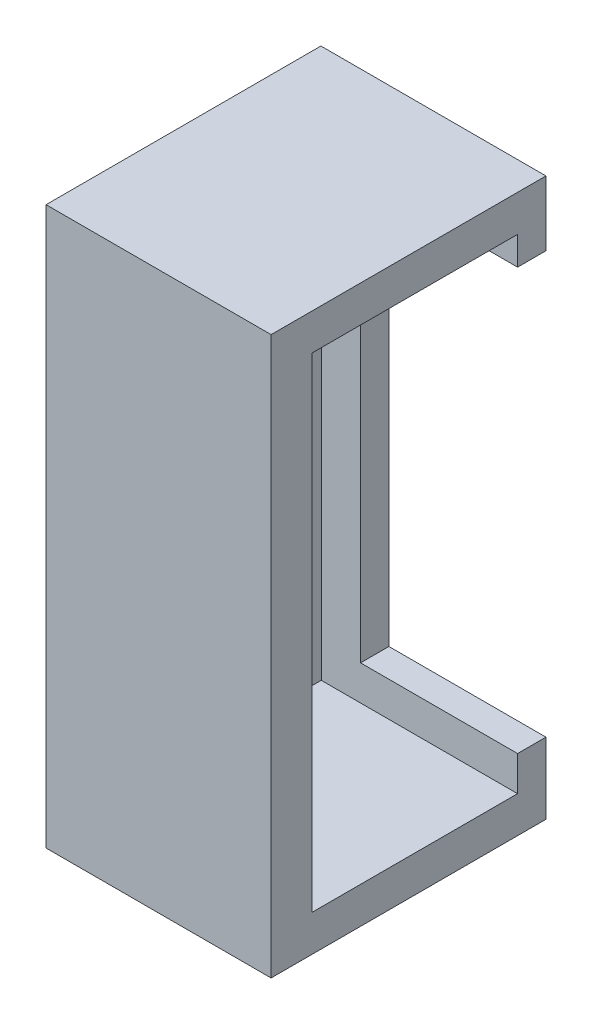
ISO-10303-21;
HEADER;
FILE_DESCRIPTION(('STEP AP214'),'2;1');
FILE_NAME('part.step','',(''),(''),'','','');
FILE_SCHEMA(('AUTOMOTIVE_DESIGN { 1 0 10303 214 1 1 1 1 }'));
ENDSEC;
DATA;
#1=APPLICATION_CONTEXT('core data for automotive mechanical design processes');
#2=APPLICATION_PROTOCOL_DEFINITION('international standard','automotive_design',2000,#1);
#3=PRODUCT_CONTEXT('',#1,'mechanical');
#4=PRODUCT('Part','Part','',(#3));
#5=PRODUCT_RELATED_PRODUCT_CATEGORY('part','',(#4));
#6=PRODUCT_DEFINITION_FORMATION('','',#4);
#7=PRODUCT_DEFINITION_CONTEXT('part definition',#1,'design');
#8=PRODUCT_DEFINITION('design','',#6,#7);
#9=PRODUCT_DEFINITION_SHAPE('','',#8);
#10=(LENGTH_UNIT() NAMED_UNIT(*) SI_UNIT(.MILLI.,.METRE.));
#11=(NAMED_UNIT(*) PLANE_ANGLE_UNIT() SI_UNIT($,.RADIAN.));
#12=(NAMED_UNIT(*) SI_UNIT($,.STERADIAN.) SOLID_ANGLE_UNIT());
#13=UNCERTAINTY_MEASURE_WITH_UNIT(LENGTH_MEASURE(1.E-05),#10,'distance_accuracy_value','');
#14=(GEOMETRIC_REPRESENTATION_CONTEXT(3) GLOBAL_UNCERTAINTY_ASSIGNED_CONTEXT((#13)) GLOBAL_UNIT_ASSIGNED_CONTEXT((#10,
#11,#12)) REPRESENTATION_CONTEXT('',''));
#15=CARTESIAN_POINT('',(0.,0.,0.));
#16=DIRECTION('',(0.,0.,1.));
#17=DIRECTION('',(1.,0.,0.));
#18=AXIS2_PLACEMENT_3D('',#15,#16,#17);
#19=CARTESIAN_POINT('',(28.6589872044418,70.9585500494591,70.));
#20=DIRECTION('',(-1.,0.,0.));
#21=DIRECTION('',(0.,0.,1.));
#22=AXIS2_PLACEMENT_3D('',#19,#20,#21);
#23=PLANE('',#22);
#24=DIRECTION('',(0.,1.,0.));
#25=VECTOR('',#24,1.);
#26=CARTESIAN_POINT('',(28.6589872044418,61.6875546341879,7.22550558069185));
#27=LINE('',#26,#25);
#28=CARTESIAN_POINT('',(28.6589872044418,54.4420343508905,7.22550558069185));
#29=VERTEX_POINT('',#28);
#30=CARTESIAN_POINT('',(28.6589872044418,61.6875546341879,7.22550558069185));
#31=VERTEX_POINT('',#30);
#32=EDGE_CURVE('E57',#29,#31,#27,.T.);
#33=ORIENTED_EDGE('',*,*,#32,.F.);
#34=DIRECTION('',(0.,0.,1.));
#35=VECTOR('',#34,1.);
#36=CARTESIAN_POINT('',(28.6589872044418,54.4420343508905,7.22550558069185));
#37=LINE('',#36,#35);
#38=CARTESIAN_POINT('',(28.6589872044418,54.4420343508905,0.));
#39=VERTEX_POINT('',#38);
#40=EDGE_CURVE('E137',#39,#29,#37,.T.);
#41=ORIENTED_EDGE('',*,*,#40,.F.);
#42=DIRECTION('',(0.,1.,0.));
#43=VECTOR('',#42,1.);
#44=CARTESIAN_POINT('',(28.6589872044418,70.9585500494591,0.));
#45=LINE('',#44,#43);
#46=CARTESIAN_POINT('',(28.6589872044418,70.9585500494591,0.));
#47=VERTEX_POINT('',#46);
#48=EDGE_CURVE('E174',#39,#47,#45,.T.);
#49=ORIENTED_EDGE('',*,*,#48,.T.);
#50=DIRECTION('',(0.,0.,-1.));
#51=VECTOR('',#50,1.);
#52=CARTESIAN_POINT('',(28.6589872044418,70.9585500494591,70.));
#53=LINE('',#52,#51);
#54=CARTESIAN_POINT('',(28.6589872044418,70.9585500494591,70.));
#55=VERTEX_POINT('',#54);
#56=EDGE_CURVE('E11',#55,#47,#53,.T.);
#57=ORIENTED_EDGE('',*,*,#56,.F.);
#58=DIRECTION('',(0.,1.,0.));
#59=VECTOR('',#58,1.);
#60=CARTESIAN_POINT('',(28.6589872044418,70.9585500494591,70.));
#61=LINE('',#60,#59);
#62=CARTESIAN_POINT('',(28.6589872044418,-70.9585500494591,70.));
#63=VERTEX_POINT('',#62);
#64=EDGE_CURVE('E180',#63,#55,#61,.T.);
#65=ORIENTED_EDGE('',*,*,#64,.F.);
#66=DIRECTION('',(0.,0.,-1.));
#67=VECTOR('',#66,1.);
#68=CARTESIAN_POINT('',(28.6589872044418,-70.9585500494591,70.));
#69=LINE('',#68,#67);
#70=CARTESIAN_POINT('',(28.6589872044418,-70.9585500494591,0.));
#71=VERTEX_POINT('',#70);
#72=EDGE_CURVE('E190',#63,#71,#69,.T.);
#73=ORIENTED_EDGE('',*,*,#72,.T.);
#74=CARTESIAN_POINT('',(28.6589872044418,-52.8319187323795,0.));
#75=VERTEX_POINT('',#74);
#76=EDGE_CURVE('E191',#71,#75,#45,.T.);
#77=ORIENTED_EDGE('',*,*,#76,.T.);
#78=DIRECTION('',(0.,0.,-1.));
#79=VECTOR('',#78,1.);
#80=CARTESIAN_POINT('',(28.6589872044418,-52.8319187323795,7.22550558069185));
#81=LINE('',#80,#79);
#82=CARTESIAN_POINT('',(28.6589872044418,-52.8319187323795,7.22550558069185));
#83=VERTEX_POINT('',#82);
#84=EDGE_CURVE('E350',#83,#75,#81,.T.);
#85=ORIENTED_EDGE('',*,*,#84,.F.);
#86=CARTESIAN_POINT('',(28.6589872044418,-61.6875546341879,7.22550558069185));
#87=VERTEX_POINT('',#86);
#88=EDGE_CURVE('E142',#87,#83,#27,.T.);
#89=ORIENTED_EDGE('',*,*,#88,.F.);
#90=DIRECTION('',(0.,0.,-1.));
#91=VECTOR('',#90,1.);
#92=CARTESIAN_POINT('',(28.6589872044418,-61.6875546341879,59.554263182287));
#93=LINE('',#92,#91);
#94=CARTESIAN_POINT('',(28.6589872044418,-61.6875546341879,59.554263182287));
#95=VERTEX_POINT('',#94);
#96=EDGE_CURVE('E153',#95,#87,#93,.T.);
#97=ORIENTED_EDGE('',*,*,#96,.F.);
#98=DIRECTION('',(0.,-1.,0.));
#99=VECTOR('',#98,1.);
#100=CARTESIAN_POINT('',(28.6589872044418,61.6875546341879,59.554263182287));
#101=LINE('',#100,#99);
#102=CARTESIAN_POINT('',(28.6589872044418,61.6875546341879,59.554263182287));
#103=VERTEX_POINT('',#102);
#104=EDGE_CURVE('E167',#103,#95,#101,.T.);
#105=ORIENTED_EDGE('',*,*,#104,.F.);
#106=DIRECTION('',(0.,0.,1.));
#107=VECTOR('',#106,1.);
#108=CARTESIAN_POINT('',(28.6589872044418,61.6875546341879,59.554263182287));
#109=LINE('',#108,#107);
#110=EDGE_CURVE('E164',#31,#103,#109,.T.);
#111=ORIENTED_EDGE('',*,*,#110,.F.);
#112=EDGE_LOOP('',(#33,#41,#49,#57,#65,#73,#77,#85,#89,#97,#105,#111));
#113=FACE_BOUND('',#112,.T.);
#114=ADVANCED_FACE('F35',(#113),#23,.F.);
#115=CARTESIAN_POINT('',(-28.6589872044418,70.9585500494591,70.));
#116=DIRECTION('',(0.,-1.,0.));
#117=DIRECTION('',(0.,0.,-1.));
#118=AXIS2_PLACEMENT_3D('',#115,#116,#117);
#119=PLANE('',#118);
#120=DIRECTION('',(-1.,0.,0.));
#121=VECTOR('',#120,1.);
#122=CARTESIAN_POINT('',(-28.6589872044418,70.9585500494591,0.));
#123=LINE('',#122,#121);
#124=CARTESIAN_POINT('',(-28.6589872044418,70.9585500494591,0.));
#125=VERTEX_POINT('',#124);
#126=EDGE_CURVE('E194',#47,#125,#123,.T.);
#127=ORIENTED_EDGE('',*,*,#126,.T.);
#128=DIRECTION('',(0.,0.,-1.));
#129=VECTOR('',#128,1.);
#130=CARTESIAN_POINT('',(-28.6589872044418,70.9585500494591,70.));
#131=LINE('',#130,#129);
#132=CARTESIAN_POINT('',(-28.6589872044418,70.9585500494591,70.));
#133=VERTEX_POINT('',#132);
#134=EDGE_CURVE('E42',#133,#125,#131,.T.);
#135=ORIENTED_EDGE('',*,*,#134,.F.);
#136=DIRECTION('',(-1.,0.,0.));
#137=VECTOR('',#136,1.);
#138=CARTESIAN_POINT('',(-28.6589872044418,70.9585500494591,70.));
#139=LINE('',#138,#137);
#140=EDGE_CURVE('E183',#55,#133,#139,.T.);
#141=ORIENTED_EDGE('',*,*,#140,.F.);
#142=ORIENTED_EDGE('',*,*,#56,.T.);
#143=EDGE_LOOP('',(#127,#135,#141,#142));
#144=FACE_BOUND('',#143,.T.);
#145=ADVANCED_FACE('F226',(#144),#119,.F.);
#146=CARTESIAN_POINT('',(-28.6589872044418,70.9585500494591,70.));
#147=DIRECTION('',(1.,0.,0.));
#148=DIRECTION('',(0.,0.,-1.));
#149=AXIS2_PLACEMENT_3D('',#146,#147,#148);
#150=PLANE('',#149);
#151=DIRECTION('',(0.,-1.,0.));
#152=VECTOR('',#151,1.);
#153=CARTESIAN_POINT('',(-28.6589872044418,70.9585500494591,0.));
#154=LINE('',#153,#152);
#155=CARTESIAN_POINT('',(-28.6589872044418,-70.9585500494591,0.));
#156=VERTEX_POINT('',#155);
#157=EDGE_CURVE('E196',#125,#156,#154,.T.);
#158=ORIENTED_EDGE('',*,*,#157,.T.);
#159=DIRECTION('',(0.,0.,-1.));
#160=VECTOR('',#159,1.);
#161=CARTESIAN_POINT('',(-28.6589872044418,-70.9585500494591,70.));
#162=LINE('',#161,#160);
#163=CARTESIAN_POINT('',(-28.6589872044418,-70.9585500494591,70.));
#164=VERTEX_POINT('',#163);
#165=EDGE_CURVE('E201',#164,#156,#162,.T.);
#166=ORIENTED_EDGE('',*,*,#165,.F.);
#167=DIRECTION('',(0.,-1.,0.));
#168=VECTOR('',#167,1.);
#169=CARTESIAN_POINT('',(-28.6589872044418,70.9585500494591,70.));
#170=LINE('',#169,#168);
#171=EDGE_CURVE('E186',#133,#164,#170,.T.);
#172=ORIENTED_EDGE('',*,*,#171,.F.);
#173=ORIENTED_EDGE('',*,*,#134,.T.);
#174=EDGE_LOOP('',(#158,#166,#172,#173));
#175=FACE_BOUND('',#174,.T.);
#176=ADVANCED_FACE('F208',(#175),#150,.F.);
#177=CARTESIAN_POINT('',(-28.6589872044418,-70.9585500494591,70.));
#178=DIRECTION('',(0.,1.,0.));
#179=DIRECTION('',(0.,0.,1.));
#180=AXIS2_PLACEMENT_3D('',#177,#178,#179);
#181=PLANE('',#180);
#182=DIRECTION('',(1.,0.,0.));
#183=VECTOR('',#182,1.);
#184=CARTESIAN_POINT('',(-28.6589872044418,-70.9585500494591,0.));
#185=LINE('',#184,#183);
#186=EDGE_CURVE('E184',#156,#71,#185,.T.);
#187=ORIENTED_EDGE('',*,*,#186,.T.);
#188=ORIENTED_EDGE('',*,*,#72,.F.);
#189=DIRECTION('',(1.,0.,0.));
#190=VECTOR('',#189,1.);
#191=CARTESIAN_POINT('',(-28.6589872044418,-70.9585500494591,70.));
#192=LINE('',#191,#190);
#193=EDGE_CURVE('E188',#164,#63,#192,.T.);
#194=ORIENTED_EDGE('',*,*,#193,.F.);
#195=ORIENTED_EDGE('',*,*,#165,.T.);
#196=EDGE_LOOP('',(#187,#188,#194,#195));
#197=FACE_BOUND('',#196,.T.);
#198=ADVANCED_FACE('F219',(#197),#181,.F.);
#199=CARTESIAN_POINT('',(0.,0.,70.));
#200=DIRECTION('',(0.,0.,1.));
#201=DIRECTION('',(1.,0.,0.));
#202=AXIS2_PLACEMENT_3D('',#199,#200,#201);
#203=PLANE('',#202);
#204=ORIENTED_EDGE('',*,*,#64,.T.);
#205=ORIENTED_EDGE('',*,*,#140,.T.);
#206=ORIENTED_EDGE('',*,*,#171,.T.);
#207=ORIENTED_EDGE('',*,*,#193,.T.);
#208=EDGE_LOOP('',(#204,#205,#206,#207));
#209=FACE_BOUND('',#208,.T.);
#210=ADVANCED_FACE('F225',(#209),#203,.T.);
#211=CARTESIAN_POINT('',(0.,0.,0.));
#212=DIRECTION('',(0.,0.,1.));
#213=DIRECTION('',(1.,0.,0.));
#214=AXIS2_PLACEMENT_3D('',#211,#212,#213);
#215=PLANE('',#214);
#216=ORIENTED_EDGE('',*,*,#48,.F.);
#217=DIRECTION('',(1.,0.,0.));
#218=VECTOR('',#217,1.);
#219=CARTESIAN_POINT('',(-11.3410127955582,54.4420343508905,0.));
#220=LINE('',#219,#218);
#221=CARTESIAN_POINT('',(-11.3410127955582,54.4420343508905,0.));
#222=VERTEX_POINT('',#221);
#223=EDGE_CURVE('E144',#222,#39,#220,.T.);
#224=ORIENTED_EDGE('',*,*,#223,.F.);
#225=DIRECTION('',(0.,1.,0.));
#226=VECTOR('',#225,1.);
#227=CARTESIAN_POINT('',(-11.3410127955582,54.4420343508905,0.));
#228=LINE('',#227,#226);
#229=CARTESIAN_POINT('',(-11.3410127955582,-52.8319187323795,0.));
#230=VERTEX_POINT('',#229);
#231=EDGE_CURVE('E132',#230,#222,#228,.T.);
#232=ORIENTED_EDGE('',*,*,#231,.F.);
#233=DIRECTION('',(1.,0.,0.));
#234=VECTOR('',#233,1.);
#235=CARTESIAN_POINT('',(-11.3410127955582,-52.8319187323795,0.));
#236=LINE('',#235,#234);
#237=EDGE_CURVE('E130',#230,#75,#236,.T.);
#238=ORIENTED_EDGE('',*,*,#237,.T.);
#239=ORIENTED_EDGE('',*,*,#76,.F.);
#240=ORIENTED_EDGE('',*,*,#186,.F.);
#241=ORIENTED_EDGE('',*,*,#157,.F.);
#242=ORIENTED_EDGE('',*,*,#126,.F.);
#243=EDGE_LOOP('',(#216,#224,#232,#238,#239,#240,#241,#242));
#244=FACE_BOUND('',#243,.T.);
#245=ADVANCED_FACE('F215',(#244),#215,.F.);
#246=CARTESIAN_POINT('',(-21.3410127955582,61.6875546341879,7.22550558069185));
#247=DIRECTION('',(0.,0.,-1.));
#248=DIRECTION('',(-1.,0.,0.));
#249=AXIS2_PLACEMENT_3D('',#246,#247,#248);
#250=PLANE('',#249);
#251=DIRECTION('',(0.,-1.,0.));
#252=VECTOR('',#251,1.);
#253=CARTESIAN_POINT('',(-11.3410127955582,54.4420343508905,7.22550558069185));
#254=LINE('',#253,#252);
#255=CARTESIAN_POINT('',(-11.3410127955582,54.4420343508905,7.22550558069185));
#256=VERTEX_POINT('',#255);
#257=CARTESIAN_POINT('',(-11.3410127955582,-52.8319187323795,7.22550558069185));
#258=VERTEX_POINT('',#257);
#259=EDGE_CURVE('E133',#256,#258,#254,.T.);
#260=ORIENTED_EDGE('',*,*,#259,.F.);
#261=DIRECTION('',(1.,0.,0.));
#262=VECTOR('',#261,1.);
#263=CARTESIAN_POINT('',(-11.3410127955582,54.4420343508905,7.22550558069185));
#264=LINE('',#263,#262);
#265=EDGE_CURVE('E348',#256,#29,#264,.T.);
#266=ORIENTED_EDGE('',*,*,#265,.T.);
#267=ORIENTED_EDGE('',*,*,#32,.T.);
#268=DIRECTION('',(1.,0.,0.));
#269=VECTOR('',#268,1.);
#270=CARTESIAN_POINT('',(-21.3410127955582,61.6875546341879,7.22550558069185));
#271=LINE('',#270,#269);
#272=CARTESIAN_POINT('',(-21.3410127955582,61.6875546341879,7.22550558069185));
#273=VERTEX_POINT('',#272);
#274=EDGE_CURVE('E162',#273,#31,#271,.T.);
#275=ORIENTED_EDGE('',*,*,#274,.F.);
#276=DIRECTION('',(0.,1.,0.));
#277=VECTOR('',#276,1.);
#278=CARTESIAN_POINT('',(-21.3410127955582,61.6875546341879,7.22550558069185));
#279=LINE('',#278,#277);
#280=CARTESIAN_POINT('',(-21.3410127955582,-61.6875546341879,7.22550558069185));
#281=VERTEX_POINT('',#280);
#282=EDGE_CURVE('E149',#281,#273,#279,.T.);
#283=ORIENTED_EDGE('',*,*,#282,.F.);
#284=DIRECTION('',(1.,0.,0.));
#285=VECTOR('',#284,1.);
#286=CARTESIAN_POINT('',(-21.3410127955582,-61.6875546341879,7.22550558069185));
#287=LINE('',#286,#285);
#288=EDGE_CURVE('E172',#281,#87,#287,.T.);
#289=ORIENTED_EDGE('',*,*,#288,.T.);
#290=ORIENTED_EDGE('',*,*,#88,.T.);
#291=DIRECTION('',(1.,0.,0.));
#292=VECTOR('',#291,1.);
#293=CARTESIAN_POINT('',(-11.3410127955582,-52.8319187323795,7.22550558069185));
#294=LINE('',#293,#292);
#295=EDGE_CURVE('E127',#258,#83,#294,.T.);
#296=ORIENTED_EDGE('',*,*,#295,.F.);
#297=EDGE_LOOP('',(#260,#266,#267,#275,#283,#289,#290,#296));
#298=FACE_BOUND('',#297,.T.);
#299=ADVANCED_FACE('F140',(#298),#250,.F.);
#300=CARTESIAN_POINT('',(-21.3410127955582,-61.6875546341879,59.554263182287));
#301=DIRECTION('',(0.,-1.,0.));
#302=DIRECTION('',(0.,0.,-1.));
#303=AXIS2_PLACEMENT_3D('',#300,#301,#302);
#304=PLANE('',#303);
#305=ORIENTED_EDGE('',*,*,#96,.T.);
#306=ORIENTED_EDGE('',*,*,#288,.F.);
#307=DIRECTION('',(0.,0.,-1.));
#308=VECTOR('',#307,1.);
#309=CARTESIAN_POINT('',(-21.3410127955582,-61.6875546341879,59.554263182287));
#310=LINE('',#309,#308);
#311=CARTESIAN_POINT('',(-21.3410127955582,-61.6875546341879,59.554263182287));
#312=VERTEX_POINT('',#311);
#313=EDGE_CURVE('E159',#312,#281,#310,.T.);
#314=ORIENTED_EDGE('',*,*,#313,.F.);
#315=DIRECTION('',(1.,0.,0.));
#316=VECTOR('',#315,1.);
#317=CARTESIAN_POINT('',(-21.3410127955582,-61.6875546341879,59.554263182287));
#318=LINE('',#317,#316);
#319=EDGE_CURVE('E175',#312,#95,#318,.T.);
#320=ORIENTED_EDGE('',*,*,#319,.T.);
#321=EDGE_LOOP('',(#305,#306,#314,#320));
#322=FACE_BOUND('',#321,.T.);
#323=ADVANCED_FACE('F242',(#322),#304,.F.);
#324=CARTESIAN_POINT('',(-21.3410127955582,61.6875546341879,59.554263182287));
#325=DIRECTION('',(0.,0.,1.));
#326=DIRECTION('',(1.,0.,0.));
#327=AXIS2_PLACEMENT_3D('',#324,#325,#326);
#328=PLANE('',#327);
#329=ORIENTED_EDGE('',*,*,#104,.T.);
#330=ORIENTED_EDGE('',*,*,#319,.F.);
#331=DIRECTION('',(0.,-1.,0.));
#332=VECTOR('',#331,1.);
#333=CARTESIAN_POINT('',(-21.3410127955582,61.6875546341879,59.554263182287));
#334=LINE('',#333,#332);
#335=CARTESIAN_POINT('',(-21.3410127955582,61.6875546341879,59.554263182287));
#336=VERTEX_POINT('',#335);
#337=EDGE_CURVE('E156',#336,#312,#334,.T.);
#338=ORIENTED_EDGE('',*,*,#337,.F.);
#339=DIRECTION('',(1.,0.,0.));
#340=VECTOR('',#339,1.);
#341=CARTESIAN_POINT('',(-21.3410127955582,61.6875546341879,59.554263182287));
#342=LINE('',#341,#340);
#343=EDGE_CURVE('E177',#336,#103,#342,.T.);
#344=ORIENTED_EDGE('',*,*,#343,.T.);
#345=EDGE_LOOP('',(#329,#330,#338,#344));
#346=FACE_BOUND('',#345,.T.);
#347=ADVANCED_FACE('F247',(#346),#328,.F.);
#348=CARTESIAN_POINT('',(-21.3410127955582,61.6875546341879,59.554263182287));
#349=DIRECTION('',(0.,1.,0.));
#350=DIRECTION('',(0.,0.,1.));
#351=AXIS2_PLACEMENT_3D('',#348,#349,#350);
#352=PLANE('',#351);
#353=ORIENTED_EDGE('',*,*,#110,.T.);
#354=ORIENTED_EDGE('',*,*,#343,.F.);
#355=DIRECTION('',(0.,0.,1.));
#356=VECTOR('',#355,1.);
#357=CARTESIAN_POINT('',(-21.3410127955582,61.6875546341879,59.554263182287));
#358=LINE('',#357,#356);
#359=EDGE_CURVE('E152',#273,#336,#358,.T.);
#360=ORIENTED_EDGE('',*,*,#359,.F.);
#361=ORIENTED_EDGE('',*,*,#274,.T.);
#362=EDGE_LOOP('',(#353,#354,#360,#361));
#363=FACE_BOUND('',#362,.T.);
#364=ADVANCED_FACE('F243',(#363),#352,.F.);
#365=CARTESIAN_POINT('',(-21.3410127955582,0.,0.));
#366=DIRECTION('',(1.,0.,0.));
#367=DIRECTION('',(0.,0.,-1.));
#368=AXIS2_PLACEMENT_3D('',#365,#366,#367);
#369=PLANE('',#368);
#370=ORIENTED_EDGE('',*,*,#282,.T.);
#371=ORIENTED_EDGE('',*,*,#359,.T.);
#372=ORIENTED_EDGE('',*,*,#337,.T.);
#373=ORIENTED_EDGE('',*,*,#313,.T.);
#374=EDGE_LOOP('',(#370,#371,#372,#373));
#375=FACE_BOUND('',#374,.T.);
#376=ADVANCED_FACE('F246',(#375),#369,.T.);
#377=CARTESIAN_POINT('',(-11.3410127955582,54.4420343508905,7.22550558069185));
#378=DIRECTION('',(0.,1.,0.));
#379=DIRECTION('',(0.,0.,1.));
#380=AXIS2_PLACEMENT_3D('',#377,#378,#379);
#381=PLANE('',#380);
#382=ORIENTED_EDGE('',*,*,#40,.T.);
#383=ORIENTED_EDGE('',*,*,#265,.F.);
#384=DIRECTION('',(0.,0.,1.));
#385=VECTOR('',#384,1.);
#386=CARTESIAN_POINT('',(-11.3410127955582,54.4420343508905,7.22550558069185));
#387=LINE('',#386,#385);
#388=EDGE_CURVE('E49',#222,#256,#387,.T.);
#389=ORIENTED_EDGE('',*,*,#388,.F.);
#390=ORIENTED_EDGE('',*,*,#223,.T.);
#391=EDGE_LOOP('',(#382,#383,#389,#390));
#392=FACE_BOUND('',#391,.T.);
#393=ADVANCED_FACE('F257',(#392),#381,.F.);
#394=CARTESIAN_POINT('',(-11.3410127955582,-52.8319187323795,7.22550558069185));
#395=DIRECTION('',(0.,-1.,0.));
#396=DIRECTION('',(0.,0.,-1.));
#397=AXIS2_PLACEMENT_3D('',#394,#395,#396);
#398=PLANE('',#397);
#399=ORIENTED_EDGE('',*,*,#84,.T.);
#400=ORIENTED_EDGE('',*,*,#237,.F.);
#401=DIRECTION('',(0.,0.,-1.));
#402=VECTOR('',#401,1.);
#403=CARTESIAN_POINT('',(-11.3410127955582,-52.8319187323795,7.22550558069185));
#404=LINE('',#403,#402);
#405=EDGE_CURVE('E124',#258,#230,#404,.T.);
#406=ORIENTED_EDGE('',*,*,#405,.F.);
#407=ORIENTED_EDGE('',*,*,#295,.T.);
#408=EDGE_LOOP('',(#399,#400,#406,#407));
#409=FACE_BOUND('',#408,.T.);
#410=ADVANCED_FACE('F125',(#409),#398,.F.);
#411=CARTESIAN_POINT('',(-11.3410127955582,0.,0.));
#412=DIRECTION('',(1.,0.,0.));
#413=DIRECTION('',(0.,0.,-1.));
#414=AXIS2_PLACEMENT_3D('',#411,#412,#413);
#415=PLANE('',#414);
#416=ORIENTED_EDGE('',*,*,#259,.T.);
#417=ORIENTED_EDGE('',*,*,#405,.T.);
#418=ORIENTED_EDGE('',*,*,#231,.T.);
#419=ORIENTED_EDGE('',*,*,#388,.T.);
#420=EDGE_LOOP('',(#416,#417,#418,#419));
#421=FACE_BOUND('',#420,.T.);
#422=ADVANCED_FACE('F136',(#421),#415,.T.);
#423=CLOSED_SHELL('',(#114,#145,#176,#198,#210,#245,#299,#323,#347,#364,#376,#393,#410,#422));
#424=MANIFOLD_SOLID_BREP('B2',#423);
#425=ADVANCED_BREP_SHAPE_REPRESENTATION('',(#18,#424),#14);
#426=SHAPE_DEFINITION_REPRESENTATION(#9,#425);
ENDSEC;
END-ISO-10303-21;
